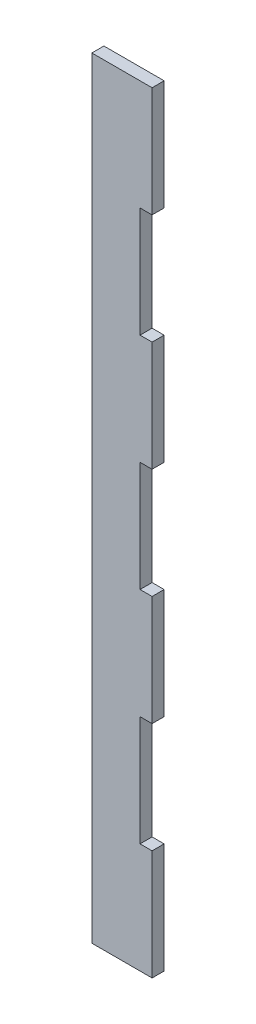
ISO-10303-21;
HEADER;
FILE_DESCRIPTION(('STEP AP214'),'2;1');
FILE_NAME('part.step','',(''),(''),'','','');
FILE_SCHEMA(('AUTOMOTIVE_DESIGN { 1 0 10303 214 1 1 1 1 }'));
ENDSEC;
DATA;
#1=APPLICATION_CONTEXT('core data for automotive mechanical design processes');
#2=APPLICATION_PROTOCOL_DEFINITION('international standard','automotive_design',2000,#1);
#3=PRODUCT_CONTEXT('',#1,'mechanical');
#4=PRODUCT('Part','Part','',(#3));
#5=PRODUCT_RELATED_PRODUCT_CATEGORY('part','',(#4));
#6=PRODUCT_DEFINITION_FORMATION('','',#4);
#7=PRODUCT_DEFINITION_CONTEXT('part definition',#1,'design');
#8=PRODUCT_DEFINITION('design','',#6,#7);
#9=PRODUCT_DEFINITION_SHAPE('','',#8);
#10=(LENGTH_UNIT() NAMED_UNIT(*) SI_UNIT(.MILLI.,.METRE.));
#11=(NAMED_UNIT(*) PLANE_ANGLE_UNIT() SI_UNIT($,.RADIAN.));
#12=(NAMED_UNIT(*) SI_UNIT($,.STERADIAN.) SOLID_ANGLE_UNIT());
#13=UNCERTAINTY_MEASURE_WITH_UNIT(LENGTH_MEASURE(1.E-05),#10,'distance_accuracy_value','');
#14=(GEOMETRIC_REPRESENTATION_CONTEXT(3) GLOBAL_UNCERTAINTY_ASSIGNED_CONTEXT((#13)) GLOBAL_UNIT_ASSIGNED_CONTEXT((#10,
#11,#12)) REPRESENTATION_CONTEXT('',''));
#15=CARTESIAN_POINT('',(0.,0.,0.));
#16=DIRECTION('',(0.,0.,1.));
#17=DIRECTION('',(1.,0.,0.));
#18=AXIS2_PLACEMENT_3D('',#15,#16,#17);
#19=CARTESIAN_POINT('',(0.,-101.6,3.175));
#20=DIRECTION('',(0.,1.,0.));
#21=DIRECTION('',(0.,0.,1.));
#22=AXIS2_PLACEMENT_3D('',#19,#20,#21);
#23=PLANE('',#22);
#24=DIRECTION('',(1.,0.,0.));
#25=VECTOR('',#24,1.);
#26=CARTESIAN_POINT('',(0.,-101.6,0.));
#27=LINE('',#26,#25);
#28=CARTESIAN_POINT('',(-6.35,-101.6,0.));
#29=VERTEX_POINT('',#28);
#30=CARTESIAN_POINT('',(9.52500000000182,-101.6,0.));
#31=VERTEX_POINT('',#30);
#32=EDGE_CURVE('E176',#29,#31,#27,.T.);
#33=ORIENTED_EDGE('',*,*,#32,.T.);
#34=DIRECTION('',(0.,0.,-1.));
#35=VECTOR('',#34,1.);
#36=CARTESIAN_POINT('',(9.52500000000182,-101.6,3.175));
#37=LINE('',#36,#35);
#38=CARTESIAN_POINT('',(9.52500000000182,-101.6,3.175));
#39=VERTEX_POINT('',#38);
#40=EDGE_CURVE('E11',#39,#31,#37,.T.);
#41=ORIENTED_EDGE('',*,*,#40,.F.);
#42=DIRECTION('',(1.,0.,0.));
#43=VECTOR('',#42,1.);
#44=CARTESIAN_POINT('',(0.,-101.6,3.175));
#45=LINE('',#44,#43);
#46=CARTESIAN_POINT('',(-6.35,-101.6,3.175));
#47=VERTEX_POINT('',#46);
#48=EDGE_CURVE('E110',#47,#39,#45,.T.);
#49=ORIENTED_EDGE('',*,*,#48,.F.);
#50=DIRECTION('',(0.,0.,-1.));
#51=VECTOR('',#50,1.);
#52=CARTESIAN_POINT('',(-6.35,-101.6,3.175));
#53=LINE('',#52,#51);
#54=EDGE_CURVE('E172',#47,#29,#53,.T.);
#55=ORIENTED_EDGE('',*,*,#54,.T.);
#56=EDGE_LOOP('',(#33,#41,#49,#55));
#57=FACE_BOUND('',#56,.T.);
#58=ADVANCED_FACE('F34',(#57),#23,.F.);
#59=CARTESIAN_POINT('',(9.52500000000182,0.,3.175));
#60=DIRECTION('',(1.,0.,0.));
#61=DIRECTION('',(0.,0.,-1.));
#62=AXIS2_PLACEMENT_3D('',#59,#60,#61);
#63=PLANE('',#62);
#64=DIRECTION('',(0.,-1.,0.));
#65=VECTOR('',#64,1.);
#66=CARTESIAN_POINT('',(9.52500000000182,0.,0.));
#67=LINE('',#66,#65);
#68=CARTESIAN_POINT('',(9.52500000000151,-72.5714285714286,0.));
#69=VERTEX_POINT('',#68);
#70=EDGE_CURVE('E179',#69,#31,#67,.T.);
#71=ORIENTED_EDGE('',*,*,#70,.F.);
#72=DIRECTION('',(0.,0.,-1.));
#73=VECTOR('',#72,1.);
#74=CARTESIAN_POINT('',(9.52500000000151,-72.5714285714286,3.175));
#75=LINE('',#74,#73);
#76=CARTESIAN_POINT('',(9.52500000000151,-72.5714285714286,3.175));
#77=VERTEX_POINT('',#76);
#78=EDGE_CURVE('E42',#77,#69,#75,.T.);
#79=ORIENTED_EDGE('',*,*,#78,.F.);
#80=DIRECTION('',(0.,-1.,0.));
#81=VECTOR('',#80,1.);
#82=CARTESIAN_POINT('',(9.52500000000182,0.,3.175));
#83=LINE('',#82,#81);
#84=EDGE_CURVE('E258',#77,#39,#83,.T.);
#85=ORIENTED_EDGE('',*,*,#84,.T.);
#86=ORIENTED_EDGE('',*,*,#40,.T.);
#87=EDGE_LOOP('',(#71,#79,#85,#86));
#88=FACE_BOUND('',#87,.T.);
#89=ADVANCED_FACE('F246',(#88),#63,.T.);
#90=CARTESIAN_POINT('',(0.,-72.5714285714286,3.175));
#91=DIRECTION('',(0.,1.,0.));
#92=DIRECTION('',(0.,0.,1.));
#93=AXIS2_PLACEMENT_3D('',#90,#91,#92);
#94=PLANE('',#93);
#95=DIRECTION('',(1.,0.,0.));
#96=VECTOR('',#95,1.);
#97=CARTESIAN_POINT('',(0.,-72.5714285714286,0.));
#98=LINE('',#97,#96);
#99=CARTESIAN_POINT('',(6.35,-72.5714285714286,0.));
#100=VERTEX_POINT('',#99);
#101=EDGE_CURVE('E182',#100,#69,#98,.T.);
#102=ORIENTED_EDGE('',*,*,#101,.F.);
#103=DIRECTION('',(0.,0.,-1.));
#104=VECTOR('',#103,1.);
#105=CARTESIAN_POINT('',(6.35,-72.5714285714286,3.175));
#106=LINE('',#105,#104);
#107=CARTESIAN_POINT('',(6.35,-72.5714285714286,3.175));
#108=VERTEX_POINT('',#107);
#109=EDGE_CURVE('E236',#108,#100,#106,.T.);
#110=ORIENTED_EDGE('',*,*,#109,.F.);
#111=DIRECTION('',(1.,0.,0.));
#112=VECTOR('',#111,1.);
#113=CARTESIAN_POINT('',(0.,-72.5714285714286,3.175));
#114=LINE('',#113,#112);
#115=EDGE_CURVE('E243',#108,#77,#114,.T.);
#116=ORIENTED_EDGE('',*,*,#115,.T.);
#117=ORIENTED_EDGE('',*,*,#78,.T.);
#118=EDGE_LOOP('',(#102,#110,#116,#117));
#119=FACE_BOUND('',#118,.T.);
#120=ADVANCED_FACE('F241',(#119),#94,.T.);
#121=CARTESIAN_POINT('',(6.35,0.,3.175));
#122=DIRECTION('',(1.,0.,0.));
#123=DIRECTION('',(0.,0.,-1.));
#124=AXIS2_PLACEMENT_3D('',#121,#122,#123);
#125=PLANE('',#124);
#126=DIRECTION('',(0.,-1.,0.));
#127=VECTOR('',#126,1.);
#128=CARTESIAN_POINT('',(6.35,0.,0.));
#129=LINE('',#128,#127);
#130=CARTESIAN_POINT('',(6.35,-43.5428571428572,0.));
#131=VERTEX_POINT('',#130);
#132=EDGE_CURVE('E185',#131,#100,#129,.T.);
#133=ORIENTED_EDGE('',*,*,#132,.F.);
#134=DIRECTION('',(0.,0.,-1.));
#135=VECTOR('',#134,1.);
#136=CARTESIAN_POINT('',(6.35,-43.5428571428572,3.175));
#137=LINE('',#136,#135);
#138=CARTESIAN_POINT('',(6.35,-43.5428571428572,3.175));
#139=VERTEX_POINT('',#138);
#140=EDGE_CURVE('E234',#139,#131,#137,.T.);
#141=ORIENTED_EDGE('',*,*,#140,.F.);
#142=DIRECTION('',(0.,-1.,0.));
#143=VECTOR('',#142,1.);
#144=CARTESIAN_POINT('',(6.35,0.,3.175));
#145=LINE('',#144,#143);
#146=EDGE_CURVE('E257',#139,#108,#145,.T.);
#147=ORIENTED_EDGE('',*,*,#146,.T.);
#148=ORIENTED_EDGE('',*,*,#109,.T.);
#149=EDGE_LOOP('',(#133,#141,#147,#148));
#150=FACE_BOUND('',#149,.T.);
#151=ADVANCED_FACE('F253',(#150),#125,.T.);
#152=CARTESIAN_POINT('',(0.,-43.5428571428572,3.175));
#153=DIRECTION('',(0.,1.,0.));
#154=DIRECTION('',(0.,0.,1.));
#155=AXIS2_PLACEMENT_3D('',#152,#153,#154);
#156=PLANE('',#155);
#157=DIRECTION('',(1.,0.,0.));
#158=VECTOR('',#157,1.);
#159=CARTESIAN_POINT('',(0.,-43.5428571428572,0.));
#160=LINE('',#159,#158);
#161=CARTESIAN_POINT('',(9.52500000000121,-43.5428571428572,0.));
#162=VERTEX_POINT('',#161);
#163=EDGE_CURVE('E188',#131,#162,#160,.T.);
#164=ORIENTED_EDGE('',*,*,#163,.T.);
#165=DIRECTION('',(0.,0.,-1.));
#166=VECTOR('',#165,1.);
#167=CARTESIAN_POINT('',(9.52500000000121,-43.5428571428572,3.175));
#168=LINE('',#167,#166);
#169=CARTESIAN_POINT('',(9.52500000000121,-43.5428571428572,3.175));
#170=VERTEX_POINT('',#169);
#171=EDGE_CURVE('E232',#170,#162,#168,.T.);
#172=ORIENTED_EDGE('',*,*,#171,.F.);
#173=DIRECTION('',(1.,0.,0.));
#174=VECTOR('',#173,1.);
#175=CARTESIAN_POINT('',(0.,-43.5428571428572,3.175));
#176=LINE('',#175,#174);
#177=EDGE_CURVE('E260',#139,#170,#176,.T.);
#178=ORIENTED_EDGE('',*,*,#177,.F.);
#179=ORIENTED_EDGE('',*,*,#140,.T.);
#180=EDGE_LOOP('',(#164,#172,#178,#179));
#181=FACE_BOUND('',#180,.T.);
#182=ADVANCED_FACE('F487',(#181),#156,.F.);
#183=CARTESIAN_POINT('',(9.52500000000121,0.,3.175));
#184=DIRECTION('',(1.,0.,0.));
#185=DIRECTION('',(0.,0.,-1.));
#186=AXIS2_PLACEMENT_3D('',#183,#184,#185);
#187=PLANE('',#186);
#188=DIRECTION('',(0.,-1.,0.));
#189=VECTOR('',#188,1.);
#190=CARTESIAN_POINT('',(9.52500000000121,0.,0.));
#191=LINE('',#190,#189);
#192=CARTESIAN_POINT('',(9.52500000000091,-14.5142857142858,0.));
#193=VERTEX_POINT('',#192);
#194=EDGE_CURVE('E193',#193,#162,#191,.T.);
#195=ORIENTED_EDGE('',*,*,#194,.F.);
#196=DIRECTION('',(0.,0.,-1.));
#197=VECTOR('',#196,1.);
#198=CARTESIAN_POINT('',(9.52500000000091,-14.5142857142858,3.175));
#199=LINE('',#198,#197);
#200=CARTESIAN_POINT('',(9.52500000000091,-14.5142857142858,3.175));
#201=VERTEX_POINT('',#200);
#202=EDGE_CURVE('E230',#201,#193,#199,.T.);
#203=ORIENTED_EDGE('',*,*,#202,.F.);
#204=DIRECTION('',(0.,-1.,0.));
#205=VECTOR('',#204,1.);
#206=CARTESIAN_POINT('',(9.52500000000121,0.,3.175));
#207=LINE('',#206,#205);
#208=EDGE_CURVE('E268',#201,#170,#207,.T.);
#209=ORIENTED_EDGE('',*,*,#208,.T.);
#210=ORIENTED_EDGE('',*,*,#171,.T.);
#211=EDGE_LOOP('',(#195,#203,#209,#210));
#212=FACE_BOUND('',#211,.T.);
#213=ADVANCED_FACE('F477',(#212),#187,.T.);
#214=CARTESIAN_POINT('',(0.,-14.5142857142858,3.175));
#215=DIRECTION('',(0.,1.,0.));
#216=DIRECTION('',(0.,0.,1.));
#217=AXIS2_PLACEMENT_3D('',#214,#215,#216);
#218=PLANE('',#217);
#219=DIRECTION('',(1.,0.,0.));
#220=VECTOR('',#219,1.);
#221=CARTESIAN_POINT('',(0.,-14.5142857142858,0.));
#222=LINE('',#221,#220);
#223=CARTESIAN_POINT('',(6.35,-14.5142857142858,0.));
#224=VERTEX_POINT('',#223);
#225=EDGE_CURVE('E196',#224,#193,#222,.T.);
#226=ORIENTED_EDGE('',*,*,#225,.F.);
#227=DIRECTION('',(0.,0.,-1.));
#228=VECTOR('',#227,1.);
#229=CARTESIAN_POINT('',(6.35,-14.5142857142858,3.175));
#230=LINE('',#229,#228);
#231=CARTESIAN_POINT('',(6.35,-14.5142857142858,3.175));
#232=VERTEX_POINT('',#231);
#233=EDGE_CURVE('E228',#232,#224,#230,.T.);
#234=ORIENTED_EDGE('',*,*,#233,.F.);
#235=DIRECTION('',(1.,0.,0.));
#236=VECTOR('',#235,1.);
#237=CARTESIAN_POINT('',(0.,-14.5142857142858,3.175));
#238=LINE('',#237,#236);
#239=EDGE_CURVE('E271',#232,#201,#238,.T.);
#240=ORIENTED_EDGE('',*,*,#239,.T.);
#241=ORIENTED_EDGE('',*,*,#202,.T.);
#242=EDGE_LOOP('',(#226,#234,#240,#241));
#243=FACE_BOUND('',#242,.T.);
#244=ADVANCED_FACE('F295',(#243),#218,.T.);
#245=CARTESIAN_POINT('',(6.35,14.5142857142857,0.));
#246=VERTEX_POINT('',#245);
#247=EDGE_CURVE('E190',#246,#224,#129,.T.);
#248=ORIENTED_EDGE('',*,*,#247,.F.);
#249=DIRECTION('',(0.,0.,-1.));
#250=VECTOR('',#249,1.);
#251=CARTESIAN_POINT('',(6.35,14.5142857142857,3.175));
#252=LINE('',#251,#250);
#253=CARTESIAN_POINT('',(6.35,14.5142857142857,3.175));
#254=VERTEX_POINT('',#253);
#255=EDGE_CURVE('E226',#254,#246,#252,.T.);
#256=ORIENTED_EDGE('',*,*,#255,.F.);
#257=EDGE_CURVE('E263',#254,#232,#145,.T.);
#258=ORIENTED_EDGE('',*,*,#257,.T.);
#259=ORIENTED_EDGE('',*,*,#233,.T.);
#260=EDGE_LOOP('',(#248,#256,#258,#259));
#261=FACE_BOUND('',#260,.T.);
#262=ADVANCED_FACE('F287',(#261),#125,.T.);
#263=CARTESIAN_POINT('',(0.,14.5142857142857,3.175));
#264=DIRECTION('',(0.,1.,0.));
#265=DIRECTION('',(0.,0.,1.));
#266=AXIS2_PLACEMENT_3D('',#263,#264,#265);
#267=PLANE('',#266);
#268=DIRECTION('',(1.,0.,0.));
#269=VECTOR('',#268,1.);
#270=CARTESIAN_POINT('',(0.,14.5142857142857,0.));
#271=LINE('',#270,#269);
#272=CARTESIAN_POINT('',(9.52500000000061,14.5142857142857,0.));
#273=VERTEX_POINT('',#272);
#274=EDGE_CURVE('E199',#246,#273,#271,.T.);
#275=ORIENTED_EDGE('',*,*,#274,.T.);
#276=DIRECTION('',(0.,0.,-1.));
#277=VECTOR('',#276,1.);
#278=CARTESIAN_POINT('',(9.52500000000061,14.5142857142857,3.175));
#279=LINE('',#278,#277);
#280=CARTESIAN_POINT('',(9.52500000000061,14.5142857142857,3.175));
#281=VERTEX_POINT('',#280);
#282=EDGE_CURVE('E224',#281,#273,#279,.T.);
#283=ORIENTED_EDGE('',*,*,#282,.F.);
#284=DIRECTION('',(1.,0.,0.));
#285=VECTOR('',#284,1.);
#286=CARTESIAN_POINT('',(0.,14.5142857142857,3.175));
#287=LINE('',#286,#285);
#288=EDGE_CURVE('E274',#254,#281,#287,.T.);
#289=ORIENTED_EDGE('',*,*,#288,.F.);
#290=ORIENTED_EDGE('',*,*,#255,.T.);
#291=EDGE_LOOP('',(#275,#283,#289,#290));
#292=FACE_BOUND('',#291,.T.);
#293=ADVANCED_FACE('F311',(#292),#267,.F.);
#294=CARTESIAN_POINT('',(9.52500000000061,0.,3.175));
#295=DIRECTION('',(1.,0.,0.));
#296=DIRECTION('',(0.,0.,-1.));
#297=AXIS2_PLACEMENT_3D('',#294,#295,#296);
#298=PLANE('',#297);
#299=DIRECTION('',(0.,-1.,0.));
#300=VECTOR('',#299,1.);
#301=CARTESIAN_POINT('',(9.52500000000061,0.,0.));
#302=LINE('',#301,#300);
#303=CARTESIAN_POINT('',(9.5250000000003,43.5428571428571,0.));
#304=VERTEX_POINT('',#303);
#305=EDGE_CURVE('E202',#304,#273,#302,.T.);
#306=ORIENTED_EDGE('',*,*,#305,.F.);
#307=DIRECTION('',(0.,0.,-1.));
#308=VECTOR('',#307,1.);
#309=CARTESIAN_POINT('',(9.5250000000003,43.5428571428571,3.175));
#310=LINE('',#309,#308);
#311=CARTESIAN_POINT('',(9.5250000000003,43.5428571428571,3.175));
#312=VERTEX_POINT('',#311);
#313=EDGE_CURVE('E222',#312,#304,#310,.T.);
#314=ORIENTED_EDGE('',*,*,#313,.F.);
#315=DIRECTION('',(0.,-1.,0.));
#316=VECTOR('',#315,1.);
#317=CARTESIAN_POINT('',(9.52500000000061,0.,3.175));
#318=LINE('',#317,#316);
#319=EDGE_CURVE('E276',#312,#281,#318,.T.);
#320=ORIENTED_EDGE('',*,*,#319,.T.);
#321=ORIENTED_EDGE('',*,*,#282,.T.);
#322=EDGE_LOOP('',(#306,#314,#320,#321));
#323=FACE_BOUND('',#322,.T.);
#324=ADVANCED_FACE('F309',(#323),#298,.T.);
#325=CARTESIAN_POINT('',(0.,43.5428571428571,3.175));
#326=DIRECTION('',(0.,1.,0.));
#327=DIRECTION('',(0.,0.,1.));
#328=AXIS2_PLACEMENT_3D('',#325,#326,#327);
#329=PLANE('',#328);
#330=DIRECTION('',(1.,0.,0.));
#331=VECTOR('',#330,1.);
#332=CARTESIAN_POINT('',(0.,43.5428571428571,0.));
#333=LINE('',#332,#331);
#334=CARTESIAN_POINT('',(6.35,43.5428571428571,0.));
#335=VERTEX_POINT('',#334);
#336=EDGE_CURVE('E205',#335,#304,#333,.T.);
#337=ORIENTED_EDGE('',*,*,#336,.F.);
#338=DIRECTION('',(0.,0.,-1.));
#339=VECTOR('',#338,1.);
#340=CARTESIAN_POINT('',(6.35,43.5428571428571,3.175));
#341=LINE('',#340,#339);
#342=CARTESIAN_POINT('',(6.35,43.5428571428571,3.175));
#343=VERTEX_POINT('',#342);
#344=EDGE_CURVE('E220',#343,#335,#341,.T.);
#345=ORIENTED_EDGE('',*,*,#344,.F.);
#346=DIRECTION('',(1.,0.,0.));
#347=VECTOR('',#346,1.);
#348=CARTESIAN_POINT('',(0.,43.5428571428571,3.175));
#349=LINE('',#348,#347);
#350=EDGE_CURVE('E279',#343,#312,#349,.T.);
#351=ORIENTED_EDGE('',*,*,#350,.T.);
#352=ORIENTED_EDGE('',*,*,#313,.T.);
#353=EDGE_LOOP('',(#337,#345,#351,#352));
#354=FACE_BOUND('',#353,.T.);
#355=ADVANCED_FACE('F306',(#354),#329,.T.);
#356=CARTESIAN_POINT('',(6.35,72.5714285714285,0.));
#357=VERTEX_POINT('',#356);
#358=EDGE_CURVE('E189',#357,#335,#129,.T.);
#359=ORIENTED_EDGE('',*,*,#358,.F.);
#360=DIRECTION('',(0.,0.,-1.));
#361=VECTOR('',#360,1.);
#362=CARTESIAN_POINT('',(6.35,72.5714285714285,3.175));
#363=LINE('',#362,#361);
#364=CARTESIAN_POINT('',(6.35,72.5714285714285,3.175));
#365=VERTEX_POINT('',#364);
#366=EDGE_CURVE('E218',#365,#357,#363,.T.);
#367=ORIENTED_EDGE('',*,*,#366,.F.);
#368=EDGE_CURVE('E262',#365,#343,#145,.T.);
#369=ORIENTED_EDGE('',*,*,#368,.T.);
#370=ORIENTED_EDGE('',*,*,#344,.T.);
#371=EDGE_LOOP('',(#359,#367,#369,#370));
#372=FACE_BOUND('',#371,.T.);
#373=ADVANCED_FACE('F303',(#372),#125,.T.);
#374=CARTESIAN_POINT('',(0.,72.5714285714285,3.175));
#375=DIRECTION('',(0.,1.,0.));
#376=DIRECTION('',(0.,0.,1.));
#377=AXIS2_PLACEMENT_3D('',#374,#375,#376);
#378=PLANE('',#377);
#379=DIRECTION('',(1.,0.,0.));
#380=VECTOR('',#379,1.);
#381=CARTESIAN_POINT('',(0.,72.5714285714285,0.));
#382=LINE('',#381,#380);
#383=CARTESIAN_POINT('',(9.525,72.5714285714285,0.));
#384=VERTEX_POINT('',#383);
#385=EDGE_CURVE('E208',#357,#384,#382,.T.);
#386=ORIENTED_EDGE('',*,*,#385,.T.);
#387=DIRECTION('',(0.,0.,-1.));
#388=VECTOR('',#387,1.);
#389=CARTESIAN_POINT('',(9.525,72.5714285714285,3.175));
#390=LINE('',#389,#388);
#391=CARTESIAN_POINT('',(9.525,72.5714285714285,3.175));
#392=VERTEX_POINT('',#391);
#393=EDGE_CURVE('E161',#392,#384,#390,.T.);
#394=ORIENTED_EDGE('',*,*,#393,.F.);
#395=DIRECTION('',(1.,0.,0.));
#396=VECTOR('',#395,1.);
#397=CARTESIAN_POINT('',(0.,72.5714285714285,3.175));
#398=LINE('',#397,#396);
#399=EDGE_CURVE('E167',#365,#392,#398,.T.);
#400=ORIENTED_EDGE('',*,*,#399,.F.);
#401=ORIENTED_EDGE('',*,*,#366,.T.);
#402=EDGE_LOOP('',(#386,#394,#400,#401));
#403=FACE_BOUND('',#402,.T.);
#404=ADVANCED_FACE('F339',(#403),#378,.F.);
#405=CARTESIAN_POINT('',(9.525,0.,3.175));
#406=DIRECTION('',(1.,0.,0.));
#407=DIRECTION('',(0.,0.,-1.));
#408=AXIS2_PLACEMENT_3D('',#405,#406,#407);
#409=PLANE('',#408);
#410=DIRECTION('',(0.,-1.,0.));
#411=VECTOR('',#410,1.);
#412=CARTESIAN_POINT('',(9.525,0.,0.));
#413=LINE('',#412,#411);
#414=CARTESIAN_POINT('',(9.525,101.6,0.));
#415=VERTEX_POINT('',#414);
#416=EDGE_CURVE('E156',#415,#384,#413,.T.);
#417=ORIENTED_EDGE('',*,*,#416,.F.);
#418=DIRECTION('',(0.,0.,-1.));
#419=VECTOR('',#418,1.);
#420=CARTESIAN_POINT('',(9.525,101.6,3.175));
#421=LINE('',#420,#419);
#422=CARTESIAN_POINT('',(9.525,101.6,3.175));
#423=VERTEX_POINT('',#422);
#424=EDGE_CURVE('E151',#423,#415,#421,.T.);
#425=ORIENTED_EDGE('',*,*,#424,.F.);
#426=DIRECTION('',(0.,-1.,0.));
#427=VECTOR('',#426,1.);
#428=CARTESIAN_POINT('',(9.525,0.,3.175));
#429=LINE('',#428,#427);
#430=EDGE_CURVE('E154',#423,#392,#429,.T.);
#431=ORIENTED_EDGE('',*,*,#430,.T.);
#432=ORIENTED_EDGE('',*,*,#393,.T.);
#433=EDGE_LOOP('',(#417,#425,#431,#432));
#434=FACE_BOUND('',#433,.T.);
#435=ADVANCED_FACE('F153',(#434),#409,.T.);
#436=CARTESIAN_POINT('',(0.,101.6,3.175));
#437=DIRECTION('',(0.,1.,0.));
#438=DIRECTION('',(0.,0.,1.));
#439=AXIS2_PLACEMENT_3D('',#436,#437,#438);
#440=PLANE('',#439);
#441=DIRECTION('',(1.,0.,0.));
#442=VECTOR('',#441,1.);
#443=CARTESIAN_POINT('',(0.,101.6,0.));
#444=LINE('',#443,#442);
#445=CARTESIAN_POINT('',(-6.35,101.6,0.));
#446=VERTEX_POINT('',#445);
#447=EDGE_CURVE('E212',#446,#415,#444,.T.);
#448=ORIENTED_EDGE('',*,*,#447,.F.);
#449=DIRECTION('',(0.,0.,-1.));
#450=VECTOR('',#449,1.);
#451=CARTESIAN_POINT('',(-6.35,101.6,3.175));
#452=LINE('',#451,#450);
#453=CARTESIAN_POINT('',(-6.35,101.6,3.175));
#454=VERTEX_POINT('',#453);
#455=EDGE_CURVE('E101',#454,#446,#452,.T.);
#456=ORIENTED_EDGE('',*,*,#455,.F.);
#457=DIRECTION('',(1.,0.,0.));
#458=VECTOR('',#457,1.);
#459=CARTESIAN_POINT('',(0.,101.6,3.175));
#460=LINE('',#459,#458);
#461=EDGE_CURVE('E164',#454,#423,#460,.T.);
#462=ORIENTED_EDGE('',*,*,#461,.T.);
#463=ORIENTED_EDGE('',*,*,#424,.T.);
#464=EDGE_LOOP('',(#448,#456,#462,#463));
#465=FACE_BOUND('',#464,.T.);
#466=ADVANCED_FACE('F170',(#465),#440,.T.);
#467=CARTESIAN_POINT('',(-6.35,0.,3.175));
#468=DIRECTION('',(1.,0.,0.));
#469=DIRECTION('',(0.,0.,-1.));
#470=AXIS2_PLACEMENT_3D('',#467,#468,#469);
#471=PLANE('',#470);
#472=DIRECTION('',(0.,-1.,0.));
#473=VECTOR('',#472,1.);
#474=CARTESIAN_POINT('',(-6.35,0.,0.));
#475=LINE('',#474,#473);
#476=EDGE_CURVE('E104',#446,#29,#475,.T.);
#477=ORIENTED_EDGE('',*,*,#476,.T.);
#478=ORIENTED_EDGE('',*,*,#54,.F.);
#479=DIRECTION('',(0.,-1.,0.));
#480=VECTOR('',#479,1.);
#481=CARTESIAN_POINT('',(-6.35,0.,3.175));
#482=LINE('',#481,#480);
#483=EDGE_CURVE('E50',#454,#47,#482,.T.);
#484=ORIENTED_EDGE('',*,*,#483,.F.);
#485=ORIENTED_EDGE('',*,*,#455,.T.);
#486=EDGE_LOOP('',(#477,#478,#484,#485));
#487=FACE_BOUND('',#486,.T.);
#488=ADVANCED_FACE('F326',(#487),#471,.F.);
#489=CARTESIAN_POINT('',(0.,0.,3.175));
#490=DIRECTION('',(0.,0.,1.));
#491=DIRECTION('',(1.,0.,0.));
#492=AXIS2_PLACEMENT_3D('',#489,#490,#491);
#493=PLANE('',#492);
#494=ORIENTED_EDGE('',*,*,#48,.T.);
#495=ORIENTED_EDGE('',*,*,#84,.F.);
#496=ORIENTED_EDGE('',*,*,#115,.F.);
#497=ORIENTED_EDGE('',*,*,#146,.F.);
#498=ORIENTED_EDGE('',*,*,#177,.T.);
#499=ORIENTED_EDGE('',*,*,#208,.F.);
#500=ORIENTED_EDGE('',*,*,#239,.F.);
#501=ORIENTED_EDGE('',*,*,#257,.F.);
#502=ORIENTED_EDGE('',*,*,#288,.T.);
#503=ORIENTED_EDGE('',*,*,#319,.F.);
#504=ORIENTED_EDGE('',*,*,#350,.F.);
#505=ORIENTED_EDGE('',*,*,#368,.F.);
#506=ORIENTED_EDGE('',*,*,#399,.T.);
#507=ORIENTED_EDGE('',*,*,#430,.F.);
#508=ORIENTED_EDGE('',*,*,#461,.F.);
#509=ORIENTED_EDGE('',*,*,#483,.T.);
#510=EDGE_LOOP('',(#494,#495,#496,#497,#498,#499,#500,#501,#502,#503,#504,#505,#506,#507,#508,#509));
#511=FACE_BOUND('',#510,.T.);
#512=ADVANCED_FACE('F163',(#511),#493,.T.);
#513=CARTESIAN_POINT('',(0.,0.,0.));
#514=DIRECTION('',(0.,0.,1.));
#515=DIRECTION('',(1.,0.,0.));
#516=AXIS2_PLACEMENT_3D('',#513,#514,#515);
#517=PLANE('',#516);
#518=ORIENTED_EDGE('',*,*,#32,.F.);
#519=ORIENTED_EDGE('',*,*,#476,.F.);
#520=ORIENTED_EDGE('',*,*,#447,.T.);
#521=ORIENTED_EDGE('',*,*,#416,.T.);
#522=ORIENTED_EDGE('',*,*,#385,.F.);
#523=ORIENTED_EDGE('',*,*,#358,.T.);
#524=ORIENTED_EDGE('',*,*,#336,.T.);
#525=ORIENTED_EDGE('',*,*,#305,.T.);
#526=ORIENTED_EDGE('',*,*,#274,.F.);
#527=ORIENTED_EDGE('',*,*,#247,.T.);
#528=ORIENTED_EDGE('',*,*,#225,.T.);
#529=ORIENTED_EDGE('',*,*,#194,.T.);
#530=ORIENTED_EDGE('',*,*,#163,.F.);
#531=ORIENTED_EDGE('',*,*,#132,.T.);
#532=ORIENTED_EDGE('',*,*,#101,.T.);
#533=ORIENTED_EDGE('',*,*,#70,.T.);
#534=EDGE_LOOP('',(#518,#519,#520,#521,#522,#523,#524,#525,#526,#527,#528,#529,#530,#531,#532,#533));
#535=FACE_BOUND('',#534,.T.);
#536=ADVANCED_FACE('F249',(#535),#517,.F.);
#537=CLOSED_SHELL('',(#58,#89,#120,#151,#182,#213,#244,#262,#293,#324,#355,#373,#404,#435,#466,
#488,#512,#536));
#538=MANIFOLD_SOLID_BREP('B2',#537);
#539=ADVANCED_BREP_SHAPE_REPRESENTATION('',(#18,#538),#14);
#540=SHAPE_DEFINITION_REPRESENTATION(#9,#539);
ENDSEC;
END-ISO-10303-21;
